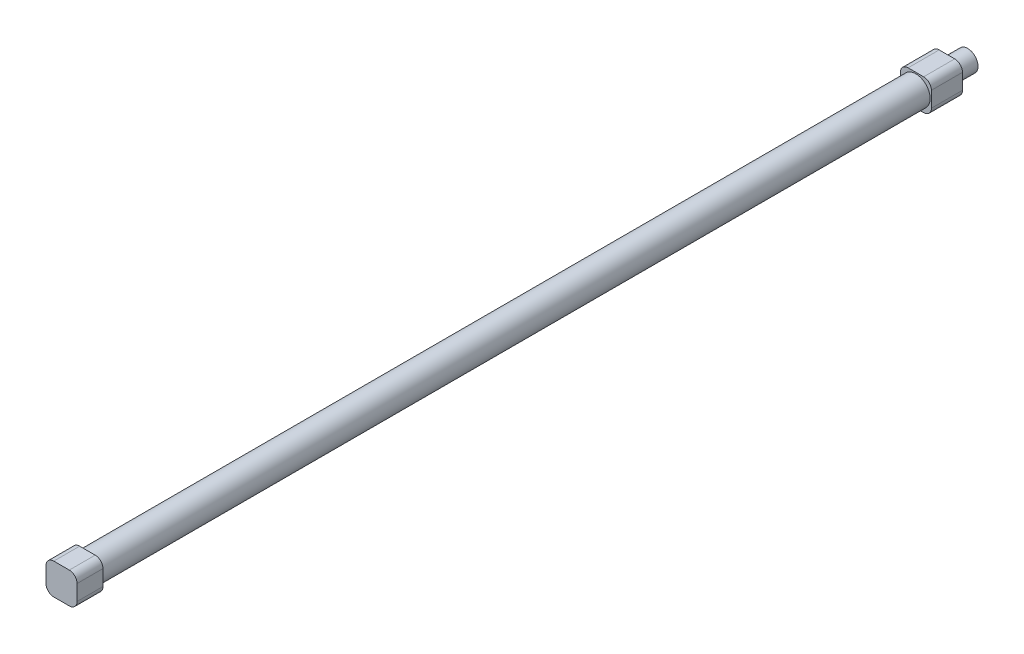
ISO-10303-21;
HEADER;
FILE_DESCRIPTION(('STEP AP214'),'2;1');
FILE_NAME('part.step','',(''),(''),'','','');
FILE_SCHEMA(('AUTOMOTIVE_DESIGN { 1 0 10303 214 1 1 1 1 }'));
ENDSEC;
DATA;
#1=APPLICATION_CONTEXT('core data for automotive mechanical design processes');
#2=APPLICATION_PROTOCOL_DEFINITION('international standard','automotive_design',2000,#1);
#3=PRODUCT_CONTEXT('',#1,'mechanical');
#4=PRODUCT('Part','Part','',(#3));
#5=PRODUCT_RELATED_PRODUCT_CATEGORY('part','',(#4));
#6=PRODUCT_DEFINITION_FORMATION('','',#4);
#7=PRODUCT_DEFINITION_CONTEXT('part definition',#1,'design');
#8=PRODUCT_DEFINITION('design','',#6,#7);
#9=PRODUCT_DEFINITION_SHAPE('','',#8);
#10=(LENGTH_UNIT() NAMED_UNIT(*) SI_UNIT(.MILLI.,.METRE.));
#11=(NAMED_UNIT(*) PLANE_ANGLE_UNIT() SI_UNIT($,.RADIAN.));
#12=(NAMED_UNIT(*) SI_UNIT($,.STERADIAN.) SOLID_ANGLE_UNIT());
#13=UNCERTAINTY_MEASURE_WITH_UNIT(LENGTH_MEASURE(1.E-05),#10,'distance_accuracy_value','');
#14=(GEOMETRIC_REPRESENTATION_CONTEXT(3) GLOBAL_UNCERTAINTY_ASSIGNED_CONTEXT((#13)) GLOBAL_UNIT_ASSIGNED_CONTEXT((#10,
#11,#12)) REPRESENTATION_CONTEXT('',''));
#15=CARTESIAN_POINT('',(0.,0.,0.));
#16=DIRECTION('',(0.,0.,1.));
#17=DIRECTION('',(1.,0.,0.));
#18=AXIS2_PLACEMENT_3D('',#15,#16,#17);
#19=CARTESIAN_POINT('',(3.,-3.,0.));
#20=DIRECTION('',(0.,0.,-1.));
#21=DIRECTION('',(-1.,0.,0.));
#22=AXIS2_PLACEMENT_3D('',#19,#20,#21);
#23=PLANE('',#22);
#24=CARTESIAN_POINT('',(0.,0.,0.));
#25=DIRECTION('',(0.,0.,-1.));
#26=DIRECTION('',(-1.,0.,0.));
#27=AXIS2_PLACEMENT_3D('',#24,#25,#26);
#28=CIRCLE('',#27,2.);
#29=CARTESIAN_POINT('',(-2.,0.,0.));
#30=VERTEX_POINT('',#29);
#31=EDGE_CURVE('E43',#30,#30,#28,.T.);
#32=ORIENTED_EDGE('',*,*,#31,.T.);
#33=EDGE_LOOP('',(#32));
#34=FACE_BOUND('',#33,.T.);
#35=CARTESIAN_POINT('',(0.,0.,0.));
#36=DIRECTION('',(0.,0.,1.));
#37=DIRECTION('',(1.,0.,0.));
#38=AXIS2_PLACEMENT_3D('',#35,#36,#37);
#39=CIRCLE('',#38,5.);
#40=CARTESIAN_POINT('',(5.,0.,0.));
#41=VERTEX_POINT('',#40);
#42=EDGE_CURVE('E50',#41,#41,#39,.T.);
#43=ORIENTED_EDGE('',*,*,#42,.T.);
#44=EDGE_LOOP('',(#43));
#45=FACE_BOUND('',#44,.T.);
#46=ADVANCED_FACE('F39',(#34,#45),#23,.F.);
#47=CARTESIAN_POINT('',(-3.,3.,320.));
#48=DIRECTION('',(0.,0.,1.));
#49=DIRECTION('',(1.,0.,0.));
#50=AXIS2_PLACEMENT_3D('',#47,#48,#49);
#51=PLANE('',#50);
#52=CARTESIAN_POINT('',(0.,0.,320.));
#53=DIRECTION('',(0.,0.,1.));
#54=DIRECTION('',(1.,0.,0.));
#55=AXIS2_PLACEMENT_3D('',#52,#53,#54);
#56=CIRCLE('',#55,5.);
#57=CARTESIAN_POINT('',(5.,0.,320.));
#58=VERTEX_POINT('',#57);
#59=EDGE_CURVE('E192',#58,#58,#56,.T.);
#60=ORIENTED_EDGE('',*,*,#59,.F.);
#61=EDGE_LOOP('',(#60));
#62=FACE_BOUND('',#61,.T.);
#63=ADVANCED_FACE('F204',(#62),#51,.F.);
#64=CARTESIAN_POINT('',(0.,0.,320.));
#65=DIRECTION('',(0.,0.,-1.));
#66=DIRECTION('',(-1.,0.,0.));
#67=AXIS2_PLACEMENT_3D('',#64,#65,#66);
#68=CYLINDRICAL_SURFACE('',#67,5.);
#69=ORIENTED_EDGE('',*,*,#59,.T.);
#70=EDGE_LOOP('',(#69));
#71=FACE_BOUND('',#70,.T.);
#72=ORIENTED_EDGE('',*,*,#42,.F.);
#73=EDGE_LOOP('',(#72));
#74=FACE_BOUND('',#73,.T.);
#75=ADVANCED_FACE('F201',(#71,#74),#68,.F.);
#76=CARTESIAN_POINT('',(0.,0.,18.));
#77=DIRECTION('',(0.,0.,-1.));
#78=DIRECTION('',(-1.,0.,0.));
#79=AXIS2_PLACEMENT_3D('',#76,#77,#78);
#80=CYLINDRICAL_SURFACE('',#79,2.);
#81=CARTESIAN_POINT('',(0.,0.,-20.));
#82=DIRECTION('',(0.,0.,-1.));
#83=DIRECTION('',(-1.,0.,0.));
#84=AXIS2_PLACEMENT_3D('',#81,#82,#83);
#85=CIRCLE('',#84,2.);
#86=CARTESIAN_POINT('',(-2.,0.,-20.));
#87=VERTEX_POINT('',#86);
#88=EDGE_CURVE('E365',#87,#87,#85,.T.);
#89=ORIENTED_EDGE('',*,*,#88,.T.);
#90=EDGE_LOOP('',(#89));
#91=FACE_BOUND('',#90,.T.);
#92=ORIENTED_EDGE('',*,*,#31,.F.);
#93=EDGE_LOOP('',(#92));
#94=FACE_BOUND('',#93,.T.);
#95=ADVANCED_FACE('F203',(#91,#94),#80,.F.);
#96=CARTESIAN_POINT('',(3.,-3.,-12.));
#97=DIRECTION('',(0.,0.,-1.));
#98=DIRECTION('',(-1.,0.,0.));
#99=AXIS2_PLACEMENT_3D('',#96,#97,#98);
#100=PLANE('',#99);
#101=CARTESIAN_POINT('',(3.,-3.,-12.));
#102=DIRECTION('',(0.,0.,-1.));
#103=DIRECTION('',(-1.,0.,0.));
#104=AXIS2_PLACEMENT_3D('',#101,#102,#103);
#105=CIRCLE('',#104,3.);
#106=CARTESIAN_POINT('',(6.,-2.99999999999998,-12.));
#107=VERTEX_POINT('',#106);
#108=CARTESIAN_POINT('',(2.99999999999998,-6.,-12.));
#109=VERTEX_POINT('',#108);
#110=EDGE_CURVE('E378',#107,#109,#105,.T.);
#111=ORIENTED_EDGE('',*,*,#110,.T.);
#112=DIRECTION('',(-1.,0.,0.));
#113=VECTOR('',#112,1.);
#114=CARTESIAN_POINT('',(2.99999999999998,-6.,-12.));
#115=LINE('',#114,#113);
#116=CARTESIAN_POINT('',(-2.99999999999998,-6.,-12.));
#117=VERTEX_POINT('',#116);
#118=EDGE_CURVE('E381',#109,#117,#115,.T.);
#119=ORIENTED_EDGE('',*,*,#118,.T.);
#120=CARTESIAN_POINT('',(-3.,-3.,-12.));
#121=DIRECTION('',(0.,0.,-1.));
#122=DIRECTION('',(-1.,0.,0.));
#123=AXIS2_PLACEMENT_3D('',#120,#121,#122);
#124=CIRCLE('',#123,3.);
#125=CARTESIAN_POINT('',(-6.,-2.99999999999998,-12.));
#126=VERTEX_POINT('',#125);
#127=EDGE_CURVE('E386',#117,#126,#124,.T.);
#128=ORIENTED_EDGE('',*,*,#127,.T.);
#129=DIRECTION('',(0.,1.,0.));
#130=VECTOR('',#129,1.);
#131=CARTESIAN_POINT('',(-6.,-2.99999999999998,-12.));
#132=LINE('',#131,#130);
#133=CARTESIAN_POINT('',(-6.,2.99999999999998,-12.));
#134=VERTEX_POINT('',#133);
#135=EDGE_CURVE('E390',#126,#134,#132,.T.);
#136=ORIENTED_EDGE('',*,*,#135,.T.);
#137=CARTESIAN_POINT('',(-3.,3.,-12.));
#138=DIRECTION('',(0.,0.,-1.));
#139=DIRECTION('',(-1.,0.,0.));
#140=AXIS2_PLACEMENT_3D('',#137,#138,#139);
#141=CIRCLE('',#140,3.);
#142=CARTESIAN_POINT('',(-2.99999999999998,6.,-12.));
#143=VERTEX_POINT('',#142);
#144=EDGE_CURVE('E394',#134,#143,#141,.T.);
#145=ORIENTED_EDGE('',*,*,#144,.T.);
#146=DIRECTION('',(1.,0.,0.));
#147=VECTOR('',#146,1.);
#148=CARTESIAN_POINT('',(2.99999999999998,6.,-12.));
#149=LINE('',#148,#147);
#150=CARTESIAN_POINT('',(2.99999999999998,6.,-12.));
#151=VERTEX_POINT('',#150);
#152=EDGE_CURVE('E398',#143,#151,#149,.T.);
#153=ORIENTED_EDGE('',*,*,#152,.T.);
#154=CARTESIAN_POINT('',(3.,3.,-12.));
#155=DIRECTION('',(0.,0.,-1.));
#156=DIRECTION('',(-1.,0.,0.));
#157=AXIS2_PLACEMENT_3D('',#154,#155,#156);
#158=CIRCLE('',#157,3.);
#159=CARTESIAN_POINT('',(6.,2.99999999999998,-12.));
#160=VERTEX_POINT('',#159);
#161=EDGE_CURVE('E402',#151,#160,#158,.T.);
#162=ORIENTED_EDGE('',*,*,#161,.T.);
#163=DIRECTION('',(0.,-1.,0.));
#164=VECTOR('',#163,1.);
#165=CARTESIAN_POINT('',(6.,-2.99999999999998,-12.));
#166=LINE('',#165,#164);
#167=EDGE_CURVE('E406',#160,#107,#166,.T.);
#168=ORIENTED_EDGE('',*,*,#167,.T.);
#169=EDGE_LOOP('',(#111,#119,#128,#136,#145,#153,#162,#168));
#170=FACE_BOUND('',#169,.T.);
#171=CARTESIAN_POINT('',(0.,0.,-12.));
#172=DIRECTION('',(0.,0.,-1.));
#173=DIRECTION('',(-1.,0.,0.));
#174=AXIS2_PLACEMENT_3D('',#171,#172,#173);
#175=CIRCLE('',#174,4.);
#176=CARTESIAN_POINT('',(-4.,0.,-12.));
#177=VERTEX_POINT('',#176);
#178=EDGE_CURVE('E374',#177,#177,#175,.T.);
#179=ORIENTED_EDGE('',*,*,#178,.F.);
#180=EDGE_LOOP('',(#179));
#181=FACE_BOUND('',#180,.T.);
#182=ADVANCED_FACE('F210',(#170,#181),#100,.T.);
#183=CARTESIAN_POINT('',(0.,0.,320.));
#184=DIRECTION('',(0.,0.,-1.));
#185=DIRECTION('',(-1.,0.,0.));
#186=AXIS2_PLACEMENT_3D('',#183,#184,#185);
#187=CYLINDRICAL_SURFACE('',#186,5.5);
#188=CARTESIAN_POINT('',(0.,0.,320.));
#189=DIRECTION('',(0.,0.,1.));
#190=DIRECTION('',(1.,0.,0.));
#191=AXIS2_PLACEMENT_3D('',#188,#189,#190);
#192=CIRCLE('',#191,5.5);
#193=CARTESIAN_POINT('',(5.5,0.,320.));
#194=VERTEX_POINT('',#193);
#195=EDGE_CURVE('E11',#194,#194,#192,.T.);
#196=ORIENTED_EDGE('',*,*,#195,.F.);
#197=EDGE_LOOP('',(#196));
#198=FACE_BOUND('',#197,.T.);
#199=CARTESIAN_POINT('',(0.,0.,0.));
#200=DIRECTION('',(0.,0.,-1.));
#201=DIRECTION('',(-1.,0.,0.));
#202=AXIS2_PLACEMENT_3D('',#199,#200,#201);
#203=CIRCLE('',#202,5.5);
#204=CARTESIAN_POINT('',(-5.5,0.,0.));
#205=VERTEX_POINT('',#204);
#206=EDGE_CURVE('E152',#205,#205,#203,.T.);
#207=ORIENTED_EDGE('',*,*,#206,.F.);
#208=EDGE_LOOP('',(#207));
#209=FACE_BOUND('',#208,.T.);
#210=ADVANCED_FACE('F41',(#198,#209),#187,.T.);
#211=CARTESIAN_POINT('',(-3.,3.,320.));
#212=DIRECTION('',(0.,0.,1.));
#213=DIRECTION('',(1.,0.,0.));
#214=AXIS2_PLACEMENT_3D('',#211,#212,#213);
#215=CIRCLE('',#214,3.);
#216=CARTESIAN_POINT('',(-3.,6.,320.));
#217=VERTEX_POINT('',#216);
#218=CARTESIAN_POINT('',(-6.,3.,320.));
#219=VERTEX_POINT('',#218);
#220=EDGE_CURVE('E147',#217,#219,#215,.T.);
#221=ORIENTED_EDGE('',*,*,#220,.F.);
#222=DIRECTION('',(-1.,0.,0.));
#223=VECTOR('',#222,1.);
#224=CARTESIAN_POINT('',(-3.,6.,320.));
#225=LINE('',#224,#223);
#226=CARTESIAN_POINT('',(3.,6.,320.));
#227=VERTEX_POINT('',#226);
#228=EDGE_CURVE('E94',#227,#217,#225,.T.);
#229=ORIENTED_EDGE('',*,*,#228,.F.);
#230=CARTESIAN_POINT('',(3.,3.,320.));
#231=DIRECTION('',(0.,0.,1.));
#232=DIRECTION('',(1.,0.,0.));
#233=AXIS2_PLACEMENT_3D('',#230,#231,#232);
#234=CIRCLE('',#233,3.);
#235=CARTESIAN_POINT('',(6.,3.,320.));
#236=VERTEX_POINT('',#235);
#237=EDGE_CURVE('E88',#236,#227,#234,.T.);
#238=ORIENTED_EDGE('',*,*,#237,.F.);
#239=DIRECTION('',(0.,1.,0.));
#240=VECTOR('',#239,1.);
#241=CARTESIAN_POINT('',(6.,-3.,320.));
#242=LINE('',#241,#240);
#243=CARTESIAN_POINT('',(6.,-3.,320.));
#244=VERTEX_POINT('',#243);
#245=EDGE_CURVE('E134',#244,#236,#242,.T.);
#246=ORIENTED_EDGE('',*,*,#245,.F.);
#247=CARTESIAN_POINT('',(3.,-3.,320.));
#248=DIRECTION('',(0.,0.,1.));
#249=DIRECTION('',(-1.,0.,0.));
#250=AXIS2_PLACEMENT_3D('',#247,#248,#249);
#251=CIRCLE('',#250,3.);
#252=CARTESIAN_POINT('',(3.,-6.,320.));
#253=VERTEX_POINT('',#252);
#254=EDGE_CURVE('E161',#253,#244,#251,.T.);
#255=ORIENTED_EDGE('',*,*,#254,.F.);
#256=DIRECTION('',(1.,0.,0.));
#257=VECTOR('',#256,1.);
#258=CARTESIAN_POINT('',(-3.,-6.,320.));
#259=LINE('',#258,#257);
#260=CARTESIAN_POINT('',(-3.,-6.,320.));
#261=VERTEX_POINT('',#260);
#262=EDGE_CURVE('E158',#261,#253,#259,.T.);
#263=ORIENTED_EDGE('',*,*,#262,.F.);
#264=CARTESIAN_POINT('',(-3.,-3.,320.));
#265=DIRECTION('',(0.,0.,1.));
#266=DIRECTION('',(1.,0.,0.));
#267=AXIS2_PLACEMENT_3D('',#264,#265,#266);
#268=CIRCLE('',#267,3.);
#269=CARTESIAN_POINT('',(-6.,-3.,320.));
#270=VERTEX_POINT('',#269);
#271=EDGE_CURVE('E155',#270,#261,#268,.T.);
#272=ORIENTED_EDGE('',*,*,#271,.F.);
#273=DIRECTION('',(0.,-1.,0.));
#274=VECTOR('',#273,1.);
#275=CARTESIAN_POINT('',(-6.,-3.,320.));
#276=LINE('',#275,#274);
#277=EDGE_CURVE('E151',#219,#270,#276,.T.);
#278=ORIENTED_EDGE('',*,*,#277,.F.);
#279=EDGE_LOOP('',(#221,#229,#238,#246,#255,#263,#272,#278));
#280=FACE_BOUND('',#279,.T.);
#281=ORIENTED_EDGE('',*,*,#195,.T.);
#282=EDGE_LOOP('',(#281));
#283=FACE_BOUND('',#282,.T.);
#284=ADVANCED_FACE('F215',(#280,#283),#51,.F.);
#285=CARTESIAN_POINT('',(-3.,3.,330.));
#286=DIRECTION('',(0.,0.,-1.));
#287=DIRECTION('',(-1.,0.,0.));
#288=AXIS2_PLACEMENT_3D('',#285,#286,#287);
#289=CYLINDRICAL_SURFACE('',#288,3.);
#290=ORIENTED_EDGE('',*,*,#220,.T.);
#291=DIRECTION('',(0.,0.,-1.));
#292=VECTOR('',#291,1.);
#293=CARTESIAN_POINT('',(-6.,3.,330.));
#294=LINE('',#293,#292);
#295=CARTESIAN_POINT('',(-6.,3.,330.));
#296=VERTEX_POINT('',#295);
#297=EDGE_CURVE('E189',#296,#219,#294,.T.);
#298=ORIENTED_EDGE('',*,*,#297,.F.);
#299=CARTESIAN_POINT('',(-3.,3.,330.));
#300=DIRECTION('',(0.,0.,1.));
#301=DIRECTION('',(1.,0.,0.));
#302=AXIS2_PLACEMENT_3D('',#299,#300,#301);
#303=CIRCLE('',#302,3.);
#304=CARTESIAN_POINT('',(-3.,6.,330.));
#305=VERTEX_POINT('',#304);
#306=EDGE_CURVE('E170',#305,#296,#303,.T.);
#307=ORIENTED_EDGE('',*,*,#306,.F.);
#308=DIRECTION('',(0.,0.,-1.));
#309=VECTOR('',#308,1.);
#310=CARTESIAN_POINT('',(-3.,6.,330.));
#311=LINE('',#310,#309);
#312=EDGE_CURVE('E143',#305,#217,#311,.T.);
#313=ORIENTED_EDGE('',*,*,#312,.T.);
#314=EDGE_LOOP('',(#290,#298,#307,#313));
#315=FACE_BOUND('',#314,.T.);
#316=ADVANCED_FACE('F282',(#315),#289,.T.);
#317=CARTESIAN_POINT('',(-6.,-3.,330.));
#318=DIRECTION('',(1.,0.,0.));
#319=DIRECTION('',(0.,0.,-1.));
#320=AXIS2_PLACEMENT_3D('',#317,#318,#319);
#321=PLANE('',#320);
#322=CARTESIAN_POINT('',(-6.,0.,324.));
#323=DIRECTION('',(-1.,0.,0.));
#324=DIRECTION('',(0.,0.,1.));
#325=AXIS2_PLACEMENT_3D('',#322,#323,#324);
#326=CIRCLE('',#325,2.);
#327=CARTESIAN_POINT('',(-6.,0.,326.));
#328=VERTEX_POINT('',#327);
#329=EDGE_CURVE('E353',#328,#328,#326,.T.);
#330=ORIENTED_EDGE('',*,*,#329,.F.);
#331=EDGE_LOOP('',(#330));
#332=FACE_BOUND('',#331,.T.);
#333=ORIENTED_EDGE('',*,*,#277,.T.);
#334=DIRECTION('',(0.,0.,-1.));
#335=VECTOR('',#334,1.);
#336=CARTESIAN_POINT('',(-6.,-3.,330.));
#337=LINE('',#336,#335);
#338=CARTESIAN_POINT('',(-6.,-3.,330.));
#339=VERTEX_POINT('',#338);
#340=EDGE_CURVE('E185',#339,#270,#337,.T.);
#341=ORIENTED_EDGE('',*,*,#340,.F.);
#342=DIRECTION('',(0.,-1.,0.));
#343=VECTOR('',#342,1.);
#344=CARTESIAN_POINT('',(-6.,-3.,330.));
#345=LINE('',#344,#343);
#346=EDGE_CURVE('E103',#296,#339,#345,.T.);
#347=ORIENTED_EDGE('',*,*,#346,.F.);
#348=ORIENTED_EDGE('',*,*,#297,.T.);
#349=EDGE_LOOP('',(#333,#341,#347,#348));
#350=FACE_BOUND('',#349,.T.);
#351=ADVANCED_FACE('F300',(#332,#350),#321,.F.);
#352=CARTESIAN_POINT('',(-3.,-3.,330.));
#353=DIRECTION('',(0.,0.,-1.));
#354=DIRECTION('',(-1.,0.,0.));
#355=AXIS2_PLACEMENT_3D('',#352,#353,#354);
#356=CYLINDRICAL_SURFACE('',#355,3.);
#357=ORIENTED_EDGE('',*,*,#271,.T.);
#358=DIRECTION('',(0.,0.,-1.));
#359=VECTOR('',#358,1.);
#360=CARTESIAN_POINT('',(-3.,-6.,330.));
#361=LINE('',#360,#359);
#362=CARTESIAN_POINT('',(-3.,-6.,330.));
#363=VERTEX_POINT('',#362);
#364=EDGE_CURVE('E181',#363,#261,#361,.T.);
#365=ORIENTED_EDGE('',*,*,#364,.F.);
#366=CARTESIAN_POINT('',(-3.,-3.,330.));
#367=DIRECTION('',(0.,0.,1.));
#368=DIRECTION('',(1.,0.,0.));
#369=AXIS2_PLACEMENT_3D('',#366,#367,#368);
#370=CIRCLE('',#369,3.);
#371=EDGE_CURVE('E260',#339,#363,#370,.T.);
#372=ORIENTED_EDGE('',*,*,#371,.F.);
#373=ORIENTED_EDGE('',*,*,#340,.T.);
#374=EDGE_LOOP('',(#357,#365,#372,#373));
#375=FACE_BOUND('',#374,.T.);
#376=ADVANCED_FACE('F297',(#375),#356,.T.);
#377=CARTESIAN_POINT('',(-3.,-6.,330.));
#378=DIRECTION('',(0.,1.,0.));
#379=DIRECTION('',(0.,0.,1.));
#380=AXIS2_PLACEMENT_3D('',#377,#378,#379);
#381=PLANE('',#380);
#382=ORIENTED_EDGE('',*,*,#262,.T.);
#383=DIRECTION('',(0.,0.,-1.));
#384=VECTOR('',#383,1.);
#385=CARTESIAN_POINT('',(3.,-6.,330.));
#386=LINE('',#385,#384);
#387=CARTESIAN_POINT('',(3.,-6.,330.));
#388=VERTEX_POINT('',#387);
#389=EDGE_CURVE('E177',#388,#253,#386,.T.);
#390=ORIENTED_EDGE('',*,*,#389,.F.);
#391=DIRECTION('',(1.,0.,0.));
#392=VECTOR('',#391,1.);
#393=CARTESIAN_POINT('',(-3.,-6.,330.));
#394=LINE('',#393,#392);
#395=EDGE_CURVE('E263',#363,#388,#394,.T.);
#396=ORIENTED_EDGE('',*,*,#395,.F.);
#397=ORIENTED_EDGE('',*,*,#364,.T.);
#398=EDGE_LOOP('',(#382,#390,#396,#397));
#399=FACE_BOUND('',#398,.T.);
#400=ADVANCED_FACE('F271',(#399),#381,.F.);
#401=CARTESIAN_POINT('',(3.,-3.,330.));
#402=DIRECTION('',(0.,0.,-1.));
#403=DIRECTION('',(-1.,0.,0.));
#404=AXIS2_PLACEMENT_3D('',#401,#402,#403);
#405=CYLINDRICAL_SURFACE('',#404,3.);
#406=ORIENTED_EDGE('',*,*,#254,.T.);
#407=DIRECTION('',(0.,0.,-1.));
#408=VECTOR('',#407,1.);
#409=CARTESIAN_POINT('',(6.,-3.,330.));
#410=LINE('',#409,#408);
#411=CARTESIAN_POINT('',(6.,-3.,330.));
#412=VERTEX_POINT('',#411);
#413=EDGE_CURVE('E136',#412,#244,#410,.T.);
#414=ORIENTED_EDGE('',*,*,#413,.F.);
#415=CARTESIAN_POINT('',(3.,-3.,330.));
#416=DIRECTION('',(0.,0.,1.));
#417=DIRECTION('',(-1.,0.,0.));
#418=AXIS2_PLACEMENT_3D('',#415,#416,#417);
#419=CIRCLE('',#418,3.);
#420=EDGE_CURVE('E125',#388,#412,#419,.T.);
#421=ORIENTED_EDGE('',*,*,#420,.F.);
#422=ORIENTED_EDGE('',*,*,#389,.T.);
#423=EDGE_LOOP('',(#406,#414,#421,#422));
#424=FACE_BOUND('',#423,.T.);
#425=ADVANCED_FACE('F275',(#424),#405,.T.);
#426=CARTESIAN_POINT('',(6.,-3.,330.));
#427=DIRECTION('',(-1.,0.,0.));
#428=DIRECTION('',(0.,-1.,0.));
#429=AXIS2_PLACEMENT_3D('',#426,#427,#428);
#430=PLANE('',#429);
#431=ORIENTED_EDGE('',*,*,#245,.T.);
#432=DIRECTION('',(0.,0.,-1.));
#433=VECTOR('',#432,1.);
#434=CARTESIAN_POINT('',(6.,3.,330.));
#435=LINE('',#434,#433);
#436=CARTESIAN_POINT('',(6.,3.,330.));
#437=VERTEX_POINT('',#436);
#438=EDGE_CURVE('E131',#437,#236,#435,.T.);
#439=ORIENTED_EDGE('',*,*,#438,.F.);
#440=DIRECTION('',(0.,1.,0.));
#441=VECTOR('',#440,1.);
#442=CARTESIAN_POINT('',(6.,-3.,330.));
#443=LINE('',#442,#441);
#444=EDGE_CURVE('E119',#412,#437,#443,.T.);
#445=ORIENTED_EDGE('',*,*,#444,.F.);
#446=ORIENTED_EDGE('',*,*,#413,.T.);
#447=EDGE_LOOP('',(#431,#439,#445,#446));
#448=FACE_BOUND('',#447,.T.);
#449=ADVANCED_FACE('F132',(#448),#430,.F.);
#450=CARTESIAN_POINT('',(3.,3.,330.));
#451=DIRECTION('',(0.,0.,-1.));
#452=DIRECTION('',(-1.,0.,0.));
#453=AXIS2_PLACEMENT_3D('',#450,#451,#452);
#454=CYLINDRICAL_SURFACE('',#453,3.);
#455=ORIENTED_EDGE('',*,*,#237,.T.);
#456=DIRECTION('',(0.,0.,-1.));
#457=VECTOR('',#456,1.);
#458=CARTESIAN_POINT('',(3.,6.,330.));
#459=LINE('',#458,#457);
#460=CARTESIAN_POINT('',(3.,6.,330.));
#461=VERTEX_POINT('',#460);
#462=EDGE_CURVE('E137',#461,#227,#459,.T.);
#463=ORIENTED_EDGE('',*,*,#462,.F.);
#464=CARTESIAN_POINT('',(3.,3.,330.));
#465=DIRECTION('',(0.,0.,1.));
#466=DIRECTION('',(1.,0.,0.));
#467=AXIS2_PLACEMENT_3D('',#464,#465,#466);
#468=CIRCLE('',#467,3.);
#469=EDGE_CURVE('E123',#437,#461,#468,.T.);
#470=ORIENTED_EDGE('',*,*,#469,.F.);
#471=ORIENTED_EDGE('',*,*,#438,.T.);
#472=EDGE_LOOP('',(#455,#463,#470,#471));
#473=FACE_BOUND('',#472,.T.);
#474=ADVANCED_FACE('F139',(#473),#454,.T.);
#475=CARTESIAN_POINT('',(-3.,6.,330.));
#476=DIRECTION('',(0.,-1.,0.));
#477=DIRECTION('',(0.,0.,-1.));
#478=AXIS2_PLACEMENT_3D('',#475,#476,#477);
#479=PLANE('',#478);
#480=ORIENTED_EDGE('',*,*,#228,.T.);
#481=ORIENTED_EDGE('',*,*,#312,.F.);
#482=DIRECTION('',(-1.,0.,0.));
#483=VECTOR('',#482,1.);
#484=CARTESIAN_POINT('',(-3.,6.,330.));
#485=LINE('',#484,#483);
#486=EDGE_CURVE('E58',#461,#305,#485,.T.);
#487=ORIENTED_EDGE('',*,*,#486,.F.);
#488=ORIENTED_EDGE('',*,*,#462,.T.);
#489=EDGE_LOOP('',(#480,#481,#487,#488));
#490=FACE_BOUND('',#489,.T.);
#491=ADVANCED_FACE('F236',(#490),#479,.F.);
#492=CARTESIAN_POINT('',(-3.,3.,330.));
#493=DIRECTION('',(0.,0.,1.));
#494=DIRECTION('',(1.,0.,0.));
#495=AXIS2_PLACEMENT_3D('',#492,#493,#494);
#496=PLANE('',#495);
#497=ORIENTED_EDGE('',*,*,#306,.T.);
#498=ORIENTED_EDGE('',*,*,#346,.T.);
#499=ORIENTED_EDGE('',*,*,#371,.T.);
#500=ORIENTED_EDGE('',*,*,#395,.T.);
#501=ORIENTED_EDGE('',*,*,#420,.T.);
#502=ORIENTED_EDGE('',*,*,#444,.T.);
#503=ORIENTED_EDGE('',*,*,#469,.T.);
#504=ORIENTED_EDGE('',*,*,#486,.T.);
#505=EDGE_LOOP('',(#497,#498,#499,#500,#501,#502,#503,#504));
#506=FACE_BOUND('',#505,.T.);
#507=ADVANCED_FACE('F121',(#506),#496,.T.);
#508=CARTESIAN_POINT('',(3.,-3.,0.));
#509=DIRECTION('',(0.,0.,-1.));
#510=DIRECTION('',(-1.,0.,0.));
#511=AXIS2_PLACEMENT_3D('',#508,#509,#510);
#512=CIRCLE('',#511,3.);
#513=CARTESIAN_POINT('',(6.,-2.99999999999998,0.));
#514=VERTEX_POINT('',#513);
#515=CARTESIAN_POINT('',(2.99999999999998,-6.,0.));
#516=VERTEX_POINT('',#515);
#517=EDGE_CURVE('E243',#514,#516,#512,.T.);
#518=ORIENTED_EDGE('',*,*,#517,.F.);
#519=DIRECTION('',(0.,-1.,0.));
#520=VECTOR('',#519,1.);
#521=CARTESIAN_POINT('',(6.,-2.99999999999998,0.));
#522=LINE('',#521,#520);
#523=CARTESIAN_POINT('',(6.,2.99999999999998,0.));
#524=VERTEX_POINT('',#523);
#525=EDGE_CURVE('E382',#524,#514,#522,.T.);
#526=ORIENTED_EDGE('',*,*,#525,.F.);
#527=CARTESIAN_POINT('',(3.,3.,0.));
#528=DIRECTION('',(0.,0.,-1.));
#529=DIRECTION('',(-1.,0.,0.));
#530=AXIS2_PLACEMENT_3D('',#527,#528,#529);
#531=CIRCLE('',#530,3.);
#532=CARTESIAN_POINT('',(2.99999999999998,6.,0.));
#533=VERTEX_POINT('',#532);
#534=EDGE_CURVE('E433',#533,#524,#531,.T.);
#535=ORIENTED_EDGE('',*,*,#534,.F.);
#536=DIRECTION('',(1.,0.,0.));
#537=VECTOR('',#536,1.);
#538=CARTESIAN_POINT('',(2.99999999999998,6.,0.));
#539=LINE('',#538,#537);
#540=CARTESIAN_POINT('',(-2.99999999999998,6.,0.));
#541=VERTEX_POINT('',#540);
#542=EDGE_CURVE('E429',#541,#533,#539,.T.);
#543=ORIENTED_EDGE('',*,*,#542,.F.);
#544=CARTESIAN_POINT('',(-3.,3.,0.));
#545=DIRECTION('',(0.,0.,-1.));
#546=DIRECTION('',(-1.,0.,0.));
#547=AXIS2_PLACEMENT_3D('',#544,#545,#546);
#548=CIRCLE('',#547,3.);
#549=CARTESIAN_POINT('',(-6.,2.99999999999998,0.));
#550=VERTEX_POINT('',#549);
#551=EDGE_CURVE('E425',#550,#541,#548,.T.);
#552=ORIENTED_EDGE('',*,*,#551,.F.);
#553=DIRECTION('',(0.,1.,0.));
#554=VECTOR('',#553,1.);
#555=CARTESIAN_POINT('',(-6.,-2.99999999999998,0.));
#556=LINE('',#555,#554);
#557=CARTESIAN_POINT('',(-6.,-2.99999999999998,0.));
#558=VERTEX_POINT('',#557);
#559=EDGE_CURVE('E421',#558,#550,#556,.T.);
#560=ORIENTED_EDGE('',*,*,#559,.F.);
#561=CARTESIAN_POINT('',(-3.,-3.,0.));
#562=DIRECTION('',(0.,0.,-1.));
#563=DIRECTION('',(-1.,0.,0.));
#564=AXIS2_PLACEMENT_3D('',#561,#562,#563);
#565=CIRCLE('',#564,3.);
#566=CARTESIAN_POINT('',(-2.99999999999998,-6.,0.));
#567=VERTEX_POINT('',#566);
#568=EDGE_CURVE('E417',#567,#558,#565,.T.);
#569=ORIENTED_EDGE('',*,*,#568,.F.);
#570=DIRECTION('',(-1.,0.,0.));
#571=VECTOR('',#570,1.);
#572=CARTESIAN_POINT('',(2.99999999999998,-6.,0.));
#573=LINE('',#572,#571);
#574=EDGE_CURVE('E413',#516,#567,#573,.T.);
#575=ORIENTED_EDGE('',*,*,#574,.F.);
#576=EDGE_LOOP('',(#518,#526,#535,#543,#552,#560,#569,#575));
#577=FACE_BOUND('',#576,.T.);
#578=ORIENTED_EDGE('',*,*,#206,.T.);
#579=EDGE_LOOP('',(#578));
#580=FACE_BOUND('',#579,.T.);
#581=ADVANCED_FACE('F220',(#577,#580),#23,.F.);
#582=CARTESIAN_POINT('',(3.,-3.,-12.));
#583=DIRECTION('',(0.,0.,1.));
#584=DIRECTION('',(1.,0.,0.));
#585=AXIS2_PLACEMENT_3D('',#582,#583,#584);
#586=CYLINDRICAL_SURFACE('',#585,3.);
#587=ORIENTED_EDGE('',*,*,#517,.T.);
#588=DIRECTION('',(0.,0.,1.));
#589=VECTOR('',#588,1.);
#590=CARTESIAN_POINT('',(2.99999999999998,-6.,-12.));
#591=LINE('',#590,#589);
#592=EDGE_CURVE('E248',#109,#516,#591,.T.);
#593=ORIENTED_EDGE('',*,*,#592,.F.);
#594=ORIENTED_EDGE('',*,*,#110,.F.);
#595=DIRECTION('',(0.,0.,1.));
#596=VECTOR('',#595,1.);
#597=CARTESIAN_POINT('',(6.,-2.99999999999998,-12.));
#598=LINE('',#597,#596);
#599=EDGE_CURVE('E410',#107,#514,#598,.T.);
#600=ORIENTED_EDGE('',*,*,#599,.T.);
#601=EDGE_LOOP('',(#587,#593,#594,#600));
#602=FACE_BOUND('',#601,.T.);
#603=ADVANCED_FACE('F227',(#602),#586,.T.);
#604=CARTESIAN_POINT('',(2.99999999999998,-6.,-12.));
#605=DIRECTION('',(0.,1.,0.));
#606=DIRECTION('',(0.,0.,1.));
#607=AXIS2_PLACEMENT_3D('',#604,#605,#606);
#608=PLANE('',#607);
#609=ORIENTED_EDGE('',*,*,#574,.T.);
#610=DIRECTION('',(0.,0.,1.));
#611=VECTOR('',#610,1.);
#612=CARTESIAN_POINT('',(-2.99999999999998,-6.,-12.));
#613=LINE('',#612,#611);
#614=EDGE_CURVE('E252',#117,#567,#613,.T.);
#615=ORIENTED_EDGE('',*,*,#614,.F.);
#616=ORIENTED_EDGE('',*,*,#118,.F.);
#617=ORIENTED_EDGE('',*,*,#592,.T.);
#618=EDGE_LOOP('',(#609,#615,#616,#617));
#619=FACE_BOUND('',#618,.T.);
#620=ADVANCED_FACE('F233',(#619),#608,.F.);
#621=CARTESIAN_POINT('',(-3.,-3.,-12.));
#622=DIRECTION('',(0.,0.,1.));
#623=DIRECTION('',(1.,0.,0.));
#624=AXIS2_PLACEMENT_3D('',#621,#622,#623);
#625=CYLINDRICAL_SURFACE('',#624,3.);
#626=ORIENTED_EDGE('',*,*,#568,.T.);
#627=DIRECTION('',(0.,0.,1.));
#628=VECTOR('',#627,1.);
#629=CARTESIAN_POINT('',(-6.,-2.99999999999998,-12.));
#630=LINE('',#629,#628);
#631=EDGE_CURVE('E459',#126,#558,#630,.T.);
#632=ORIENTED_EDGE('',*,*,#631,.F.);
#633=ORIENTED_EDGE('',*,*,#127,.F.);
#634=ORIENTED_EDGE('',*,*,#614,.T.);
#635=EDGE_LOOP('',(#626,#632,#633,#634));
#636=FACE_BOUND('',#635,.T.);
#637=ADVANCED_FACE('F469',(#636),#625,.T.);
#638=CARTESIAN_POINT('',(-6.,-2.99999999999998,-12.));
#639=DIRECTION('',(1.,0.,0.));
#640=DIRECTION('',(0.,0.,-1.));
#641=AXIS2_PLACEMENT_3D('',#638,#639,#640);
#642=PLANE('',#641);
#643=CARTESIAN_POINT('',(-6.,0.,-4.));
#644=DIRECTION('',(-1.,0.,0.));
#645=DIRECTION('',(0.,0.,1.));
#646=AXIS2_PLACEMENT_3D('',#643,#644,#645);
#647=CIRCLE('',#646,2.);
#648=CARTESIAN_POINT('',(-6.,0.,-2.));
#649=VERTEX_POINT('',#648);
#650=EDGE_CURVE('E352',#649,#649,#647,.T.);
#651=ORIENTED_EDGE('',*,*,#650,.F.);
#652=EDGE_LOOP('',(#651));
#653=FACE_BOUND('',#652,.T.);
#654=ORIENTED_EDGE('',*,*,#559,.T.);
#655=DIRECTION('',(0.,0.,1.));
#656=VECTOR('',#655,1.);
#657=CARTESIAN_POINT('',(-6.,2.99999999999998,-12.));
#658=LINE('',#657,#656);
#659=EDGE_CURVE('E455',#134,#550,#658,.T.);
#660=ORIENTED_EDGE('',*,*,#659,.F.);
#661=ORIENTED_EDGE('',*,*,#135,.F.);
#662=ORIENTED_EDGE('',*,*,#631,.T.);
#663=EDGE_LOOP('',(#654,#660,#661,#662));
#664=FACE_BOUND('',#663,.T.);
#665=ADVANCED_FACE('F484',(#653,#664),#642,.F.);
#666=CARTESIAN_POINT('',(-3.,3.,-12.));
#667=DIRECTION('',(0.,0.,1.));
#668=DIRECTION('',(1.,0.,0.));
#669=AXIS2_PLACEMENT_3D('',#666,#667,#668);
#670=CYLINDRICAL_SURFACE('',#669,3.);
#671=ORIENTED_EDGE('',*,*,#551,.T.);
#672=DIRECTION('',(0.,0.,1.));
#673=VECTOR('',#672,1.);
#674=CARTESIAN_POINT('',(-2.99999999999998,6.,-12.));
#675=LINE('',#674,#673);
#676=EDGE_CURVE('E451',#143,#541,#675,.T.);
#677=ORIENTED_EDGE('',*,*,#676,.F.);
#678=ORIENTED_EDGE('',*,*,#144,.F.);
#679=ORIENTED_EDGE('',*,*,#659,.T.);
#680=EDGE_LOOP('',(#671,#677,#678,#679));
#681=FACE_BOUND('',#680,.T.);
#682=ADVANCED_FACE('F491',(#681),#670,.T.);
#683=CARTESIAN_POINT('',(2.99999999999998,6.,-12.));
#684=DIRECTION('',(0.,-1.,0.));
#685=DIRECTION('',(0.,0.,-1.));
#686=AXIS2_PLACEMENT_3D('',#683,#684,#685);
#687=PLANE('',#686);
#688=ORIENTED_EDGE('',*,*,#542,.T.);
#689=DIRECTION('',(0.,0.,1.));
#690=VECTOR('',#689,1.);
#691=CARTESIAN_POINT('',(2.99999999999998,6.,-12.));
#692=LINE('',#691,#690);
#693=EDGE_CURVE('E447',#151,#533,#692,.T.);
#694=ORIENTED_EDGE('',*,*,#693,.F.);
#695=ORIENTED_EDGE('',*,*,#152,.F.);
#696=ORIENTED_EDGE('',*,*,#676,.T.);
#697=EDGE_LOOP('',(#688,#694,#695,#696));
#698=FACE_BOUND('',#697,.T.);
#699=ADVANCED_FACE('F533',(#698),#687,.F.);
#700=CARTESIAN_POINT('',(3.,3.,-12.));
#701=DIRECTION('',(0.,0.,1.));
#702=DIRECTION('',(1.,0.,0.));
#703=AXIS2_PLACEMENT_3D('',#700,#701,#702);
#704=CYLINDRICAL_SURFACE('',#703,3.);
#705=ORIENTED_EDGE('',*,*,#534,.T.);
#706=DIRECTION('',(0.,0.,1.));
#707=VECTOR('',#706,1.);
#708=CARTESIAN_POINT('',(6.,2.99999999999998,-12.));
#709=LINE('',#708,#707);
#710=EDGE_CURVE('E443',#160,#524,#709,.T.);
#711=ORIENTED_EDGE('',*,*,#710,.F.);
#712=ORIENTED_EDGE('',*,*,#161,.F.);
#713=ORIENTED_EDGE('',*,*,#693,.T.);
#714=EDGE_LOOP('',(#705,#711,#712,#713));
#715=FACE_BOUND('',#714,.T.);
#716=ADVANCED_FACE('F536',(#715),#704,.T.);
#717=CARTESIAN_POINT('',(6.,-2.99999999999998,-12.));
#718=DIRECTION('',(-1.,0.,0.));
#719=DIRECTION('',(0.,0.,1.));
#720=AXIS2_PLACEMENT_3D('',#717,#718,#719);
#721=PLANE('',#720);
#722=ORIENTED_EDGE('',*,*,#525,.T.);
#723=ORIENTED_EDGE('',*,*,#599,.F.);
#724=ORIENTED_EDGE('',*,*,#167,.F.);
#725=ORIENTED_EDGE('',*,*,#710,.T.);
#726=EDGE_LOOP('',(#722,#723,#724,#725));
#727=FACE_BOUND('',#726,.T.);
#728=ADVANCED_FACE('F326',(#727),#721,.F.);
#729=CARTESIAN_POINT('',(0.,0.,-20.));
#730=DIRECTION('',(0.,0.,1.));
#731=DIRECTION('',(1.,0.,0.));
#732=AXIS2_PLACEMENT_3D('',#729,#730,#731);
#733=CYLINDRICAL_SURFACE('',#732,4.);
#734=CARTESIAN_POINT('',(0.,0.,-20.));
#735=DIRECTION('',(0.,0.,-1.));
#736=DIRECTION('',(-1.,0.,0.));
#737=AXIS2_PLACEMENT_3D('',#734,#735,#736);
#738=CIRCLE('',#737,4.);
#739=CARTESIAN_POINT('',(-4.,0.,-20.));
#740=VERTEX_POINT('',#739);
#741=EDGE_CURVE('E370',#740,#740,#738,.T.);
#742=ORIENTED_EDGE('',*,*,#741,.F.);
#743=EDGE_LOOP('',(#742));
#744=FACE_BOUND('',#743,.T.);
#745=ORIENTED_EDGE('',*,*,#178,.T.);
#746=EDGE_LOOP('',(#745));
#747=FACE_BOUND('',#746,.T.);
#748=ADVANCED_FACE('F322',(#744,#747),#733,.T.);
#749=CARTESIAN_POINT('',(0.,0.,-20.));
#750=DIRECTION('',(0.,0.,-1.));
#751=DIRECTION('',(-1.,0.,0.));
#752=AXIS2_PLACEMENT_3D('',#749,#750,#751);
#753=PLANE('',#752);
#754=ORIENTED_EDGE('',*,*,#88,.F.);
#755=EDGE_LOOP('',(#754));
#756=FACE_BOUND('',#755,.T.);
#757=ORIENTED_EDGE('',*,*,#741,.T.);
#758=EDGE_LOOP('',(#757));
#759=FACE_BOUND('',#758,.T.);
#760=ADVANCED_FACE('F325',(#756,#759),#753,.T.);
#761=CARTESIAN_POINT('',(-3.,0.,-4.));
#762=DIRECTION('',(-1.,0.,0.));
#763=DIRECTION('',(0.,0.,1.));
#764=AXIS2_PLACEMENT_3D('',#761,#762,#763);
#765=CYLINDRICAL_SURFACE('',#764,2.);
#766=CARTESIAN_POINT('',(-3.,0.,-4.));
#767=DIRECTION('',(-1.,0.,0.));
#768=DIRECTION('',(0.,0.,1.));
#769=AXIS2_PLACEMENT_3D('',#766,#767,#768);
#770=CIRCLE('',#769,2.);
#771=CARTESIAN_POINT('',(-3.,0.,-2.));
#772=VERTEX_POINT('',#771);
#773=EDGE_CURVE('E358',#772,#772,#770,.T.);
#774=ORIENTED_EDGE('',*,*,#773,.F.);
#775=EDGE_LOOP('',(#774));
#776=FACE_BOUND('',#775,.T.);
#777=ORIENTED_EDGE('',*,*,#650,.T.);
#778=EDGE_LOOP('',(#777));
#779=FACE_BOUND('',#778,.T.);
#780=ADVANCED_FACE('F329',(#776,#779),#765,.F.);
#781=CARTESIAN_POINT('',(-3.,0.,-4.));
#782=DIRECTION('',(-1.,0.,0.));
#783=DIRECTION('',(0.,0.,1.));
#784=AXIS2_PLACEMENT_3D('',#781,#782,#783);
#785=PLANE('',#784);
#786=ORIENTED_EDGE('',*,*,#773,.T.);
#787=EDGE_LOOP('',(#786));
#788=FACE_BOUND('',#787,.T.);
#789=ADVANCED_FACE('F334',(#788),#785,.T.);
#790=CARTESIAN_POINT('',(-3.,0.,324.));
#791=DIRECTION('',(-1.,0.,0.));
#792=DIRECTION('',(0.,0.,1.));
#793=AXIS2_PLACEMENT_3D('',#790,#791,#792);
#794=CYLINDRICAL_SURFACE('',#793,2.);
#795=CARTESIAN_POINT('',(-3.,0.,324.));
#796=DIRECTION('',(-1.,0.,0.));
#797=DIRECTION('',(0.,0.,1.));
#798=AXIS2_PLACEMENT_3D('',#795,#796,#797);
#799=CIRCLE('',#798,2.);
#800=CARTESIAN_POINT('',(-3.,0.,326.));
#801=VERTEX_POINT('',#800);
#802=EDGE_CURVE('E350',#801,#801,#799,.T.);
#803=ORIENTED_EDGE('',*,*,#802,.F.);
#804=EDGE_LOOP('',(#803));
#805=FACE_BOUND('',#804,.T.);
#806=ORIENTED_EDGE('',*,*,#329,.T.);
#807=EDGE_LOOP('',(#806));
#808=FACE_BOUND('',#807,.T.);
#809=ADVANCED_FACE('F338',(#805,#808),#794,.F.);
#810=CARTESIAN_POINT('',(-3.,0.,324.));
#811=DIRECTION('',(-1.,0.,0.));
#812=DIRECTION('',(0.,0.,1.));
#813=AXIS2_PLACEMENT_3D('',#810,#811,#812);
#814=PLANE('',#813);
#815=ORIENTED_EDGE('',*,*,#802,.T.);
#816=EDGE_LOOP('',(#815));
#817=FACE_BOUND('',#816,.T.);
#818=ADVANCED_FACE('F342',(#817),#814,.T.);
#819=CLOSED_SHELL('',(#46,#63,#75,#95,#182,#210,#284,#316,#351,#376,#400,#425,#449,#474,#491,
#507,#581,#603,#620,#637,#665,#682,#699,#716,#728,#748,#760,#780,#789,#809,#818));
#820=MANIFOLD_SOLID_BREP('B2',#819);
#821=ADVANCED_BREP_SHAPE_REPRESENTATION('',(#18,#820),#14);
#822=SHAPE_DEFINITION_REPRESENTATION(#9,#821);
ENDSEC;
END-ISO-10303-21;
